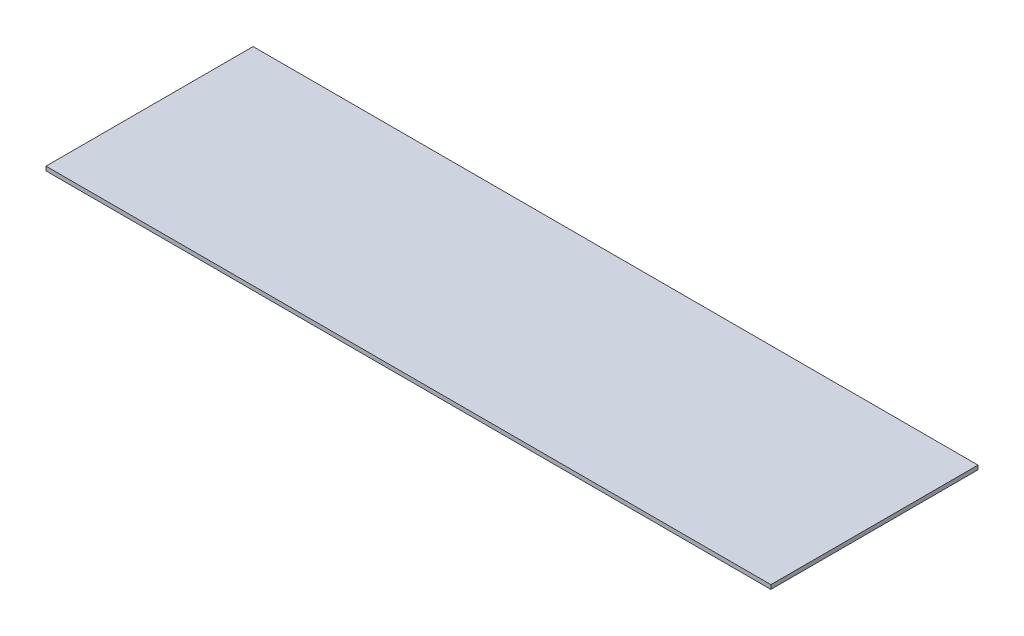
ISO-10303-21;
HEADER;
FILE_DESCRIPTION(('STEP AP214'),'2;1');
FILE_NAME('part.step','',(''),(''),'','','');
FILE_SCHEMA(('AUTOMOTIVE_DESIGN { 1 0 10303 214 1 1 1 1 }'));
ENDSEC;
DATA;
#1=APPLICATION_CONTEXT('core data for automotive mechanical design processes');
#2=APPLICATION_PROTOCOL_DEFINITION('international standard','automotive_design',2000,#1);
#3=PRODUCT_CONTEXT('',#1,'mechanical');
#4=PRODUCT('Part','Part','',(#3));
#5=PRODUCT_RELATED_PRODUCT_CATEGORY('part','',(#4));
#6=PRODUCT_DEFINITION_FORMATION('','',#4);
#7=PRODUCT_DEFINITION_CONTEXT('part definition',#1,'design');
#8=PRODUCT_DEFINITION('design','',#6,#7);
#9=PRODUCT_DEFINITION_SHAPE('','',#8);
#10=(LENGTH_UNIT() NAMED_UNIT(*) SI_UNIT(.MILLI.,.METRE.));
#11=(NAMED_UNIT(*) PLANE_ANGLE_UNIT() SI_UNIT($,.RADIAN.));
#12=(NAMED_UNIT(*) SI_UNIT($,.STERADIAN.) SOLID_ANGLE_UNIT());
#13=UNCERTAINTY_MEASURE_WITH_UNIT(LENGTH_MEASURE(1.E-05),#10,'distance_accuracy_value','');
#14=(GEOMETRIC_REPRESENTATION_CONTEXT(3) GLOBAL_UNCERTAINTY_ASSIGNED_CONTEXT((#13)) GLOBAL_UNIT_ASSIGNED_CONTEXT((#10,
#11,#12)) REPRESENTATION_CONTEXT('',''));
#15=CARTESIAN_POINT('',(0.,0.,0.));
#16=DIRECTION('',(0.,0.,1.));
#17=DIRECTION('',(1.,0.,0.));
#18=AXIS2_PLACEMENT_3D('',#15,#16,#17);
#19=CARTESIAN_POINT('',(70.,0.8,20.));
#20=DIRECTION('',(-1.,0.,0.));
#21=DIRECTION('',(0.,0.,1.));
#22=AXIS2_PLACEMENT_3D('',#19,#20,#21);
#23=PLANE('',#22);
#24=DIRECTION('',(0.,0.,-1.));
#25=VECTOR('',#24,1.);
#26=CARTESIAN_POINT('',(70.,0.,20.));
#27=LINE('',#26,#25);
#28=CARTESIAN_POINT('',(70.,0.,20.));
#29=VERTEX_POINT('',#28);
#30=CARTESIAN_POINT('',(70.,0.,-20.));
#31=VERTEX_POINT('',#30);
#32=EDGE_CURVE('E114',#29,#31,#27,.T.);
#33=ORIENTED_EDGE('',*,*,#32,.T.);
#34=DIRECTION('',(0.,-1.,0.));
#35=VECTOR('',#34,1.);
#36=CARTESIAN_POINT('',(70.,0.8,-20.));
#37=LINE('',#36,#35);
#38=CARTESIAN_POINT('',(70.,0.8,-20.));
#39=VERTEX_POINT('',#38);
#40=EDGE_CURVE('E11',#39,#31,#37,.T.);
#41=ORIENTED_EDGE('',*,*,#40,.F.);
#42=DIRECTION('',(0.,0.,-1.));
#43=VECTOR('',#42,1.);
#44=CARTESIAN_POINT('',(70.,0.8,20.));
#45=LINE('',#44,#43);
#46=CARTESIAN_POINT('',(70.,0.8,20.));
#47=VERTEX_POINT('',#46);
#48=EDGE_CURVE('E100',#47,#39,#45,.T.);
#49=ORIENTED_EDGE('',*,*,#48,.F.);
#50=DIRECTION('',(0.,-1.,0.));
#51=VECTOR('',#50,1.);
#52=CARTESIAN_POINT('',(70.,0.8,20.));
#53=LINE('',#52,#51);
#54=EDGE_CURVE('E108',#47,#29,#53,.T.);
#55=ORIENTED_EDGE('',*,*,#54,.T.);
#56=EDGE_LOOP('',(#33,#41,#49,#55));
#57=FACE_BOUND('',#56,.T.);
#58=ADVANCED_FACE('F44',(#57),#23,.F.);
#59=CARTESIAN_POINT('',(-70.,0.8,-20.));
#60=DIRECTION('',(0.,0.,1.));
#61=DIRECTION('',(1.,0.,0.));
#62=AXIS2_PLACEMENT_3D('',#59,#60,#61);
#63=PLANE('',#62);
#64=DIRECTION('',(-1.,0.,0.));
#65=VECTOR('',#64,1.);
#66=CARTESIAN_POINT('',(-70.,0.,-20.));
#67=LINE('',#66,#65);
#68=CARTESIAN_POINT('',(-70.,0.,-20.));
#69=VERTEX_POINT('',#68);
#70=EDGE_CURVE('E105',#31,#69,#67,.T.);
#71=ORIENTED_EDGE('',*,*,#70,.T.);
#72=DIRECTION('',(0.,-1.,0.));
#73=VECTOR('',#72,1.);
#74=CARTESIAN_POINT('',(-70.,0.8,-20.));
#75=LINE('',#74,#73);
#76=CARTESIAN_POINT('',(-70.,0.8,-20.));
#77=VERTEX_POINT('',#76);
#78=EDGE_CURVE('E53',#77,#69,#75,.T.);
#79=ORIENTED_EDGE('',*,*,#78,.F.);
#80=DIRECTION('',(-1.,0.,0.));
#81=VECTOR('',#80,1.);
#82=CARTESIAN_POINT('',(-70.,0.8,-20.));
#83=LINE('',#82,#81);
#84=EDGE_CURVE('E95',#39,#77,#83,.T.);
#85=ORIENTED_EDGE('',*,*,#84,.F.);
#86=ORIENTED_EDGE('',*,*,#40,.T.);
#87=EDGE_LOOP('',(#71,#79,#85,#86));
#88=FACE_BOUND('',#87,.T.);
#89=ADVANCED_FACE('F101',(#88),#63,.F.);
#90=CARTESIAN_POINT('',(-70.,0.8,20.));
#91=DIRECTION('',(1.,0.,0.));
#92=DIRECTION('',(0.,0.,-1.));
#93=AXIS2_PLACEMENT_3D('',#90,#91,#92);
#94=PLANE('',#93);
#95=DIRECTION('',(0.,0.,1.));
#96=VECTOR('',#95,1.);
#97=CARTESIAN_POINT('',(-70.,0.,20.));
#98=LINE('',#97,#96);
#99=CARTESIAN_POINT('',(-70.,0.,20.));
#100=VERTEX_POINT('',#99);
#101=EDGE_CURVE('E78',#69,#100,#98,.T.);
#102=ORIENTED_EDGE('',*,*,#101,.T.);
#103=DIRECTION('',(0.,-1.,0.));
#104=VECTOR('',#103,1.);
#105=CARTESIAN_POINT('',(-70.,0.8,20.));
#106=LINE('',#105,#104);
#107=CARTESIAN_POINT('',(-70.,0.8,20.));
#108=VERTEX_POINT('',#107);
#109=EDGE_CURVE('E102',#108,#100,#106,.T.);
#110=ORIENTED_EDGE('',*,*,#109,.F.);
#111=DIRECTION('',(0.,0.,1.));
#112=VECTOR('',#111,1.);
#113=CARTESIAN_POINT('',(-70.,0.8,20.));
#114=LINE('',#113,#112);
#115=EDGE_CURVE('E92',#77,#108,#114,.T.);
#116=ORIENTED_EDGE('',*,*,#115,.F.);
#117=ORIENTED_EDGE('',*,*,#78,.T.);
#118=EDGE_LOOP('',(#102,#110,#116,#117));
#119=FACE_BOUND('',#118,.T.);
#120=ADVANCED_FACE('F104',(#119),#94,.F.);
#121=CARTESIAN_POINT('',(-70.,0.8,20.));
#122=DIRECTION('',(0.,0.,-1.));
#123=DIRECTION('',(-1.,0.,0.));
#124=AXIS2_PLACEMENT_3D('',#121,#122,#123);
#125=PLANE('',#124);
#126=DIRECTION('',(1.,0.,0.));
#127=VECTOR('',#126,1.);
#128=CARTESIAN_POINT('',(-70.,0.,20.));
#129=LINE('',#128,#127);
#130=EDGE_CURVE('E83',#100,#29,#129,.T.);
#131=ORIENTED_EDGE('',*,*,#130,.T.);
#132=ORIENTED_EDGE('',*,*,#54,.F.);
#133=DIRECTION('',(1.,0.,0.));
#134=VECTOR('',#133,1.);
#135=CARTESIAN_POINT('',(-70.,0.8,20.));
#136=LINE('',#135,#134);
#137=EDGE_CURVE('E65',#108,#47,#136,.T.);
#138=ORIENTED_EDGE('',*,*,#137,.F.);
#139=ORIENTED_EDGE('',*,*,#109,.T.);
#140=EDGE_LOOP('',(#131,#132,#138,#139));
#141=FACE_BOUND('',#140,.T.);
#142=ADVANCED_FACE('F127',(#141),#125,.F.);
#143=CARTESIAN_POINT('',(0.,0.8,0.));
#144=DIRECTION('',(0.,-1.,0.));
#145=DIRECTION('',(0.,0.,-1.));
#146=AXIS2_PLACEMENT_3D('',#143,#144,#145);
#147=PLANE('',#146);
#148=ORIENTED_EDGE('',*,*,#48,.T.);
#149=ORIENTED_EDGE('',*,*,#84,.T.);
#150=ORIENTED_EDGE('',*,*,#115,.T.);
#151=ORIENTED_EDGE('',*,*,#137,.T.);
#152=EDGE_LOOP('',(#148,#149,#150,#151));
#153=FACE_BOUND('',#152,.T.);
#154=ADVANCED_FACE('F91',(#153),#147,.F.);
#155=CARTESIAN_POINT('',(0.,0.,0.));
#156=DIRECTION('',(0.,-1.,0.));
#157=DIRECTION('',(0.,0.,-1.));
#158=AXIS2_PLACEMENT_3D('',#155,#156,#157);
#159=PLANE('',#158);
#160=ORIENTED_EDGE('',*,*,#32,.F.);
#161=ORIENTED_EDGE('',*,*,#130,.F.);
#162=ORIENTED_EDGE('',*,*,#101,.F.);
#163=ORIENTED_EDGE('',*,*,#70,.F.);
#164=EDGE_LOOP('',(#160,#161,#162,#163));
#165=FACE_BOUND('',#164,.T.);
#166=ADVANCED_FACE('F129',(#165),#159,.T.);
#167=CLOSED_SHELL('',(#58,#89,#120,#142,#154,#166));
#168=MANIFOLD_SOLID_BREP('B2',#167);
#169=ADVANCED_BREP_SHAPE_REPRESENTATION('',(#18,#168),#14);
#170=SHAPE_DEFINITION_REPRESENTATION(#9,#169);
ENDSEC;
END-ISO-10303-21;
